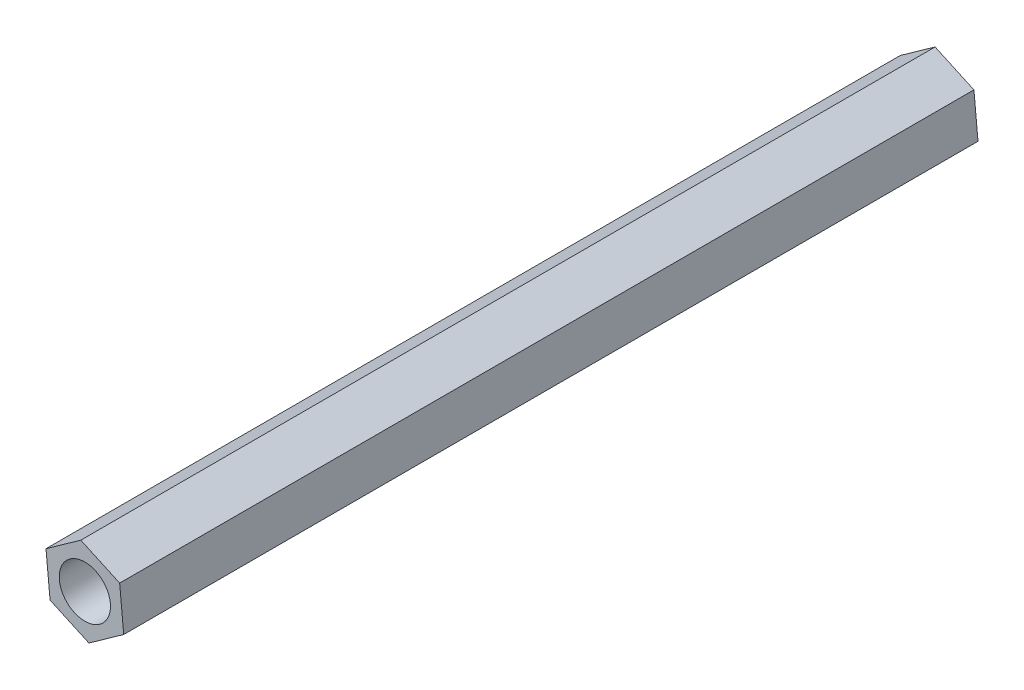
ISO-10303-21;
HEADER;
FILE_DESCRIPTION(('STEP AP214'),'2;1');
FILE_NAME('part.step','',(''),(''),'','','');
FILE_SCHEMA(('AUTOMOTIVE_DESIGN { 1 0 10303 214 1 1 1 1 }'));
ENDSEC;
DATA;
#1=APPLICATION_CONTEXT('core data for automotive mechanical design processes');
#2=APPLICATION_PROTOCOL_DEFINITION('international standard','automotive_design',2000,#1);
#3=PRODUCT_CONTEXT('',#1,'mechanical');
#4=PRODUCT('Part','Part','',(#3));
#5=PRODUCT_RELATED_PRODUCT_CATEGORY('part','',(#4));
#6=PRODUCT_DEFINITION_FORMATION('','',#4);
#7=PRODUCT_DEFINITION_CONTEXT('part definition',#1,'design');
#8=PRODUCT_DEFINITION('design','',#6,#7);
#9=PRODUCT_DEFINITION_SHAPE('','',#8);
#10=(LENGTH_UNIT() NAMED_UNIT(*) SI_UNIT(.MILLI.,.METRE.));
#11=(NAMED_UNIT(*) PLANE_ANGLE_UNIT() SI_UNIT($,.RADIAN.));
#12=(NAMED_UNIT(*) SI_UNIT($,.STERADIAN.) SOLID_ANGLE_UNIT());
#13=UNCERTAINTY_MEASURE_WITH_UNIT(LENGTH_MEASURE(1.E-05),#10,'distance_accuracy_value','');
#14=(GEOMETRIC_REPRESENTATION_CONTEXT(3) GLOBAL_UNCERTAINTY_ASSIGNED_CONTEXT((#13)) GLOBAL_UNIT_ASSIGNED_CONTEXT((#10,
#11,#12)) REPRESENTATION_CONTEXT('',''));
#15=CARTESIAN_POINT('',(0.,0.,0.));
#16=DIRECTION('',(0.,0.,1.));
#17=DIRECTION('',(1.,0.,0.));
#18=AXIS2_PLACEMENT_3D('',#15,#16,#17);
#19=CARTESIAN_POINT('',(0.,0.,50.));
#20=DIRECTION('',(0.,0.,1.));
#21=DIRECTION('',(1.,0.,0.));
#22=AXIS2_PLACEMENT_3D('',#19,#20,#21);
#23=PLANE('',#22);
#24=DIRECTION('',(-0.0950721836324173,0.995470381226566,0.));
#25=VECTOR('',#24,1.);
#26=CARTESIAN_POINT('',(2.27409682668349,-1.03850066098588,50.));
#27=LINE('',#26,#25);
#28=CARTESIAN_POINT('',(2.27409682668349,-1.03850066098588,50.));
#29=VERTEX_POINT('',#28);
#30=CARTESIAN_POINT('',(2.03641636760244,1.45017529208054,50.));
#31=VERTEX_POINT('',#30);
#32=EDGE_CURVE('E146',#29,#31,#27,.T.);
#33=ORIENTED_EDGE('',*,*,#32,.T.);
#34=DIRECTION('',(-0.909638730673394,0.41540026439435,0.));
#35=VECTOR('',#34,1.);
#36=CARTESIAN_POINT('',(2.03641636760244,1.45017529208054,50.));
#37=LINE('',#36,#35);
#38=CARTESIAN_POINT('',(-0.237680459081043,2.48867595306641,50.));
#39=VERTEX_POINT('',#38);
#40=EDGE_CURVE('E94',#31,#39,#37,.T.);
#41=ORIENTED_EDGE('',*,*,#40,.T.);
#42=DIRECTION('',(-0.814566547040977,-0.580070116832216,0.));
#43=VECTOR('',#42,1.);
#44=CARTESIAN_POINT('',(-0.237680459081043,2.48867595306641,50.));
#45=LINE('',#44,#43);
#46=CARTESIAN_POINT('',(-2.27409682668349,1.03850066098588,50.));
#47=VERTEX_POINT('',#46);
#48=EDGE_CURVE('E107',#39,#47,#45,.T.);
#49=ORIENTED_EDGE('',*,*,#48,.T.);
#50=DIRECTION('',(0.0950721836324175,-0.995470381226566,0.));
#51=VECTOR('',#50,1.);
#52=CARTESIAN_POINT('',(-2.27409682668349,1.03850066098588,50.));
#53=LINE('',#52,#51);
#54=CARTESIAN_POINT('',(-2.03641636760244,-1.45017529208054,50.));
#55=VERTEX_POINT('',#54);
#56=EDGE_CURVE('E101',#47,#55,#53,.T.);
#57=ORIENTED_EDGE('',*,*,#56,.T.);
#58=DIRECTION('',(0.909638730673394,-0.41540026439435,0.));
#59=VECTOR('',#58,1.);
#60=CARTESIAN_POINT('',(-2.03641636760244,-1.45017529208054,50.));
#61=LINE('',#60,#59);
#62=CARTESIAN_POINT('',(0.237680459081043,-2.48867595306641,50.));
#63=VERTEX_POINT('',#62);
#64=EDGE_CURVE('E105',#55,#63,#61,.T.);
#65=ORIENTED_EDGE('',*,*,#64,.T.);
#66=DIRECTION('',(0.814566547040977,0.580070116832215,0.));
#67=VECTOR('',#66,1.);
#68=CARTESIAN_POINT('',(0.237680459081043,-2.48867595306641,50.));
#69=LINE('',#68,#67);
#70=EDGE_CURVE('E57',#63,#29,#69,.T.);
#71=ORIENTED_EDGE('',*,*,#70,.T.);
#72=EDGE_LOOP('',(#33,#41,#49,#57,#65,#71));
#73=FACE_BOUND('',#72,.T.);
#74=CARTESIAN_POINT('',(0.,0.,50.));
#75=DIRECTION('',(0.,0.,1.));
#76=DIRECTION('',(1.,0.,0.));
#77=AXIS2_PLACEMENT_3D('',#74,#75,#76);
#78=CIRCLE('',#77,1.5);
#79=CARTESIAN_POINT('',(1.5,0.,50.));
#80=VERTEX_POINT('',#79);
#81=EDGE_CURVE('E134',#80,#80,#78,.T.);
#82=ORIENTED_EDGE('',*,*,#81,.F.);
#83=EDGE_LOOP('',(#82));
#84=FACE_BOUND('',#83,.T.);
#85=ADVANCED_FACE('F39',(#73,#84),#23,.T.);
#86=CARTESIAN_POINT('',(0.,0.,0.));
#87=DIRECTION('',(0.,0.,1.));
#88=DIRECTION('',(1.,0.,0.));
#89=AXIS2_PLACEMENT_3D('',#86,#87,#88);
#90=PLANE('',#89);
#91=DIRECTION('',(-0.0950721836324173,0.995470381226566,0.));
#92=VECTOR('',#91,1.);
#93=CARTESIAN_POINT('',(2.27409682668349,-1.03850066098588,0.));
#94=LINE('',#93,#92);
#95=CARTESIAN_POINT('',(2.27409682668349,-1.03850066098588,0.));
#96=VERTEX_POINT('',#95);
#97=CARTESIAN_POINT('',(2.03641636760244,1.45017529208054,0.));
#98=VERTEX_POINT('',#97);
#99=EDGE_CURVE('E129',#96,#98,#94,.T.);
#100=ORIENTED_EDGE('',*,*,#99,.F.);
#101=DIRECTION('',(0.814566547040977,0.580070116832215,0.));
#102=VECTOR('',#101,1.);
#103=CARTESIAN_POINT('',(0.237680459081043,-2.48867595306641,0.));
#104=LINE('',#103,#102);
#105=CARTESIAN_POINT('',(0.237680459081043,-2.48867595306641,0.));
#106=VERTEX_POINT('',#105);
#107=EDGE_CURVE('E86',#106,#96,#104,.T.);
#108=ORIENTED_EDGE('',*,*,#107,.F.);
#109=DIRECTION('',(0.909638730673394,-0.41540026439435,0.));
#110=VECTOR('',#109,1.);
#111=CARTESIAN_POINT('',(-2.03641636760244,-1.45017529208054,0.));
#112=LINE('',#111,#110);
#113=CARTESIAN_POINT('',(-2.03641636760244,-1.45017529208054,0.));
#114=VERTEX_POINT('',#113);
#115=EDGE_CURVE('E80',#114,#106,#112,.T.);
#116=ORIENTED_EDGE('',*,*,#115,.F.);
#117=DIRECTION('',(0.0950721836324175,-0.995470381226566,0.));
#118=VECTOR('',#117,1.);
#119=CARTESIAN_POINT('',(-2.27409682668349,1.03850066098588,0.));
#120=LINE('',#119,#118);
#121=CARTESIAN_POINT('',(-2.27409682668349,1.03850066098588,0.));
#122=VERTEX_POINT('',#121);
#123=EDGE_CURVE('E116',#122,#114,#120,.T.);
#124=ORIENTED_EDGE('',*,*,#123,.F.);
#125=DIRECTION('',(-0.814566547040977,-0.580070116832216,0.));
#126=VECTOR('',#125,1.);
#127=CARTESIAN_POINT('',(-0.237680459081043,2.48867595306641,0.));
#128=LINE('',#127,#126);
#129=CARTESIAN_POINT('',(-0.237680459081043,2.48867595306641,0.));
#130=VERTEX_POINT('',#129);
#131=EDGE_CURVE('E137',#130,#122,#128,.T.);
#132=ORIENTED_EDGE('',*,*,#131,.F.);
#133=DIRECTION('',(-0.909638730673394,0.41540026439435,0.));
#134=VECTOR('',#133,1.);
#135=CARTESIAN_POINT('',(2.03641636760244,1.45017529208054,0.));
#136=LINE('',#135,#134);
#137=EDGE_CURVE('E133',#98,#130,#136,.T.);
#138=ORIENTED_EDGE('',*,*,#137,.F.);
#139=EDGE_LOOP('',(#100,#108,#116,#124,#132,#138));
#140=FACE_BOUND('',#139,.T.);
#141=CARTESIAN_POINT('',(0.,0.,0.));
#142=DIRECTION('',(0.,0.,1.));
#143=DIRECTION('',(1.,0.,0.));
#144=AXIS2_PLACEMENT_3D('',#141,#142,#143);
#145=CIRCLE('',#144,1.5);
#146=CARTESIAN_POINT('',(1.5,0.,0.));
#147=VERTEX_POINT('',#146);
#148=EDGE_CURVE('E243',#147,#147,#145,.T.);
#149=ORIENTED_EDGE('',*,*,#148,.T.);
#150=EDGE_LOOP('',(#149));
#151=FACE_BOUND('',#150,.T.);
#152=ADVANCED_FACE('F159',(#140,#151),#90,.F.);
#153=CARTESIAN_POINT('',(2.27409682668349,-1.03850066098588,50.));
#154=DIRECTION('',(-0.995470381226566,-0.0950721836324173,0.));
#155=DIRECTION('',(0.0950721836324173,-0.995470381226566,0.));
#156=AXIS2_PLACEMENT_3D('',#153,#154,#155);
#157=PLANE('',#156);
#158=ORIENTED_EDGE('',*,*,#99,.T.);
#159=DIRECTION('',(0.,0.,-1.));
#160=VECTOR('',#159,1.);
#161=CARTESIAN_POINT('',(2.03641636760244,1.45017529208054,50.));
#162=LINE('',#161,#160);
#163=EDGE_CURVE('E11',#31,#98,#162,.T.);
#164=ORIENTED_EDGE('',*,*,#163,.F.);
#165=ORIENTED_EDGE('',*,*,#32,.F.);
#166=DIRECTION('',(0.,0.,-1.));
#167=VECTOR('',#166,1.);
#168=CARTESIAN_POINT('',(2.27409682668349,-1.03850066098588,50.));
#169=LINE('',#168,#167);
#170=EDGE_CURVE('E125',#29,#96,#169,.T.);
#171=ORIENTED_EDGE('',*,*,#170,.T.);
#172=EDGE_LOOP('',(#158,#164,#165,#171));
#173=FACE_BOUND('',#172,.T.);
#174=ADVANCED_FACE('F41',(#173),#157,.F.);
#175=CARTESIAN_POINT('',(2.03641636760244,1.45017529208054,50.));
#176=DIRECTION('',(-0.41540026439435,-0.909638730673394,0.));
#177=DIRECTION('',(0.909638730673394,-0.41540026439435,0.));
#178=AXIS2_PLACEMENT_3D('',#175,#176,#177);
#179=PLANE('',#178);
#180=ORIENTED_EDGE('',*,*,#137,.T.);
#181=DIRECTION('',(0.,0.,-1.));
#182=VECTOR('',#181,1.);
#183=CARTESIAN_POINT('',(-0.237680459081043,2.48867595306641,50.));
#184=LINE('',#183,#182);
#185=EDGE_CURVE('E49',#39,#130,#184,.T.);
#186=ORIENTED_EDGE('',*,*,#185,.F.);
#187=ORIENTED_EDGE('',*,*,#40,.F.);
#188=ORIENTED_EDGE('',*,*,#163,.T.);
#189=EDGE_LOOP('',(#180,#186,#187,#188));
#190=FACE_BOUND('',#189,.T.);
#191=ADVANCED_FACE('F184',(#190),#179,.F.);
#192=CARTESIAN_POINT('',(-0.237680459081043,2.48867595306641,50.));
#193=DIRECTION('',(0.580070116832216,-0.814566547040977,0.));
#194=DIRECTION('',(0.814566547040977,0.580070116832216,0.));
#195=AXIS2_PLACEMENT_3D('',#192,#193,#194);
#196=PLANE('',#195);
#197=ORIENTED_EDGE('',*,*,#131,.T.);
#198=DIRECTION('',(0.,0.,-1.));
#199=VECTOR('',#198,1.);
#200=CARTESIAN_POINT('',(-2.27409682668349,1.03850066098588,50.));
#201=LINE('',#200,#199);
#202=EDGE_CURVE('E118',#47,#122,#201,.T.);
#203=ORIENTED_EDGE('',*,*,#202,.F.);
#204=ORIENTED_EDGE('',*,*,#48,.F.);
#205=ORIENTED_EDGE('',*,*,#185,.T.);
#206=EDGE_LOOP('',(#197,#203,#204,#205));
#207=FACE_BOUND('',#206,.T.);
#208=ADVANCED_FACE('F156',(#207),#196,.F.);
#209=CARTESIAN_POINT('',(-2.27409682668349,1.03850066098588,50.));
#210=DIRECTION('',(0.995470381226566,0.0950721836324175,0.));
#211=DIRECTION('',(-0.0950721836324175,0.995470381226566,0.));
#212=AXIS2_PLACEMENT_3D('',#209,#210,#211);
#213=PLANE('',#212);
#214=ORIENTED_EDGE('',*,*,#123,.T.);
#215=DIRECTION('',(0.,0.,-1.));
#216=VECTOR('',#215,1.);
#217=CARTESIAN_POINT('',(-2.03641636760244,-1.45017529208054,50.));
#218=LINE('',#217,#216);
#219=EDGE_CURVE('E113',#55,#114,#218,.T.);
#220=ORIENTED_EDGE('',*,*,#219,.F.);
#221=ORIENTED_EDGE('',*,*,#56,.F.);
#222=ORIENTED_EDGE('',*,*,#202,.T.);
#223=EDGE_LOOP('',(#214,#220,#221,#222));
#224=FACE_BOUND('',#223,.T.);
#225=ADVANCED_FACE('F114',(#224),#213,.F.);
#226=CARTESIAN_POINT('',(-2.03641636760244,-1.45017529208054,50.));
#227=DIRECTION('',(0.41540026439435,0.909638730673394,0.));
#228=DIRECTION('',(-0.909638730673394,0.41540026439435,0.));
#229=AXIS2_PLACEMENT_3D('',#226,#227,#228);
#230=PLANE('',#229);
#231=ORIENTED_EDGE('',*,*,#115,.T.);
#232=DIRECTION('',(0.,0.,-1.));
#233=VECTOR('',#232,1.);
#234=CARTESIAN_POINT('',(0.237680459081043,-2.48867595306641,50.));
#235=LINE('',#234,#233);
#236=EDGE_CURVE('E119',#63,#106,#235,.T.);
#237=ORIENTED_EDGE('',*,*,#236,.F.);
#238=ORIENTED_EDGE('',*,*,#64,.F.);
#239=ORIENTED_EDGE('',*,*,#219,.T.);
#240=EDGE_LOOP('',(#231,#237,#238,#239));
#241=FACE_BOUND('',#240,.T.);
#242=ADVANCED_FACE('F121',(#241),#230,.F.);
#243=CARTESIAN_POINT('',(0.237680459081043,-2.48867595306641,50.));
#244=DIRECTION('',(-0.580070116832215,0.814566547040977,0.));
#245=DIRECTION('',(-0.814566547040977,-0.580070116832215,0.));
#246=AXIS2_PLACEMENT_3D('',#243,#244,#245);
#247=PLANE('',#246);
#248=ORIENTED_EDGE('',*,*,#107,.T.);
#249=ORIENTED_EDGE('',*,*,#170,.F.);
#250=ORIENTED_EDGE('',*,*,#70,.F.);
#251=ORIENTED_EDGE('',*,*,#236,.T.);
#252=EDGE_LOOP('',(#248,#249,#250,#251));
#253=FACE_BOUND('',#252,.T.);
#254=ADVANCED_FACE('F164',(#253),#247,.F.);
#255=CARTESIAN_POINT('',(0.,0.,50.));
#256=DIRECTION('',(0.,0.,-1.));
#257=DIRECTION('',(-1.,0.,0.));
#258=AXIS2_PLACEMENT_3D('',#255,#256,#257);
#259=CYLINDRICAL_SURFACE('',#258,1.5);
#260=ORIENTED_EDGE('',*,*,#81,.T.);
#261=EDGE_LOOP('',(#260));
#262=FACE_BOUND('',#261,.T.);
#263=ORIENTED_EDGE('',*,*,#148,.F.);
#264=EDGE_LOOP('',(#263));
#265=FACE_BOUND('',#264,.T.);
#266=ADVANCED_FACE('F166',(#262,#265),#259,.F.);
#267=CLOSED_SHELL('',(#85,#152,#174,#191,#208,#225,#242,#254,#266));
#268=MANIFOLD_SOLID_BREP('B2',#267);
#269=ADVANCED_BREP_SHAPE_REPRESENTATION('',(#18,#268),#14);
#270=SHAPE_DEFINITION_REPRESENTATION(#9,#269);
ENDSEC;
END-ISO-10303-21;
